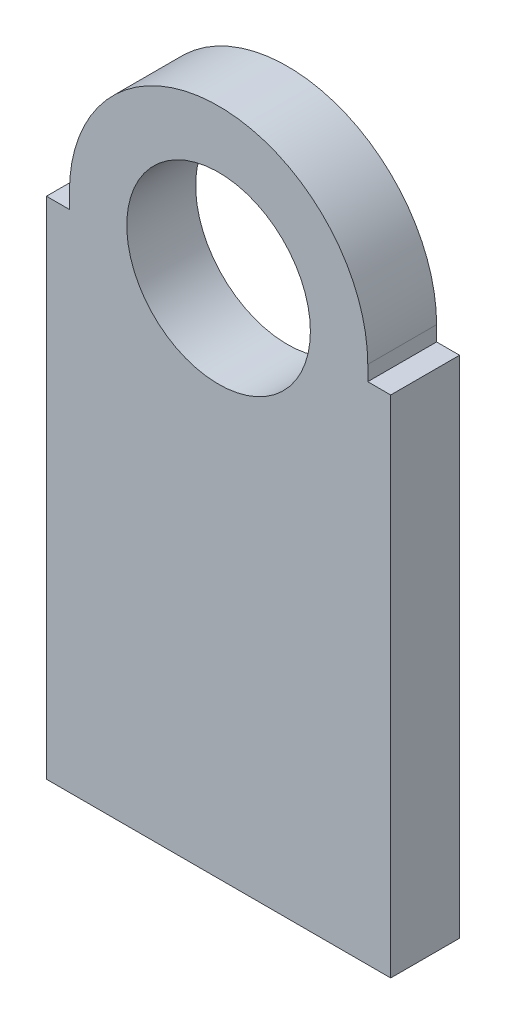
ISO-10303-21;
HEADER;
FILE_DESCRIPTION(('STEP AP214'),'2;1');
FILE_NAME('part.step','',(''),(''),'','','');
FILE_SCHEMA(('AUTOMOTIVE_DESIGN { 1 0 10303 214 1 1 1 1 }'));
ENDSEC;
DATA;
#1=APPLICATION_CONTEXT('core data for automotive mechanical design processes');
#2=APPLICATION_PROTOCOL_DEFINITION('international standard','automotive_design',2000,#1);
#3=PRODUCT_CONTEXT('',#1,'mechanical');
#4=PRODUCT('Part','Part','',(#3));
#5=PRODUCT_RELATED_PRODUCT_CATEGORY('part','',(#4));
#6=PRODUCT_DEFINITION_FORMATION('','',#4);
#7=PRODUCT_DEFINITION_CONTEXT('part definition',#1,'design');
#8=PRODUCT_DEFINITION('design','',#6,#7);
#9=PRODUCT_DEFINITION_SHAPE('','',#8);
#10=(LENGTH_UNIT() NAMED_UNIT(*) SI_UNIT(.MILLI.,.METRE.));
#11=(NAMED_UNIT(*) PLANE_ANGLE_UNIT() SI_UNIT($,.RADIAN.));
#12=(NAMED_UNIT(*) SI_UNIT($,.STERADIAN.) SOLID_ANGLE_UNIT());
#13=UNCERTAINTY_MEASURE_WITH_UNIT(LENGTH_MEASURE(1.E-05),#10,'distance_accuracy_value','');
#14=(GEOMETRIC_REPRESENTATION_CONTEXT(3) GLOBAL_UNCERTAINTY_ASSIGNED_CONTEXT((#13)) GLOBAL_UNIT_ASSIGNED_CONTEXT((#10,
#11,#12)) REPRESENTATION_CONTEXT('',''));
#15=CARTESIAN_POINT('',(0.,0.,0.));
#16=DIRECTION('',(0.,0.,1.));
#17=DIRECTION('',(1.,0.,0.));
#18=AXIS2_PLACEMENT_3D('',#15,#16,#17);
#19=CARTESIAN_POINT('',(3.25,0.,1.5));
#20=DIRECTION('',(1.,0.,0.));
#21=DIRECTION('',(0.,0.,-1.));
#22=AXIS2_PLACEMENT_3D('',#19,#20,#21);
#23=PLANE('',#22);
#24=DIRECTION('',(0.,-1.,0.));
#25=VECTOR('',#24,1.);
#26=CARTESIAN_POINT('',(3.25,0.,0.));
#27=LINE('',#26,#25);
#28=CARTESIAN_POINT('',(3.25,0.,0.));
#29=VERTEX_POINT('',#28);
#30=CARTESIAN_POINT('',(3.25,-0.326709371490288,0.));
#31=VERTEX_POINT('',#30);
#32=EDGE_CURVE('E146',#29,#31,#27,.T.);
#33=ORIENTED_EDGE('',*,*,#32,.F.);
#34=DIRECTION('',(0.,0.,-1.));
#35=VECTOR('',#34,1.);
#36=CARTESIAN_POINT('',(3.25,0.,1.5));
#37=LINE('',#36,#35);
#38=CARTESIAN_POINT('',(3.25,0.,1.5));
#39=VERTEX_POINT('',#38);
#40=EDGE_CURVE('E11',#39,#29,#37,.T.);
#41=ORIENTED_EDGE('',*,*,#40,.F.);
#42=DIRECTION('',(0.,-1.,0.));
#43=VECTOR('',#42,1.);
#44=CARTESIAN_POINT('',(3.25,0.,1.5));
#45=LINE('',#44,#43);
#46=CARTESIAN_POINT('',(3.25,-0.326709371490288,1.5));
#47=VERTEX_POINT('',#46);
#48=EDGE_CURVE('E177',#39,#47,#45,.T.);
#49=ORIENTED_EDGE('',*,*,#48,.T.);
#50=DIRECTION('',(0.,0.,-1.));
#51=VECTOR('',#50,1.);
#52=CARTESIAN_POINT('',(3.25,-0.326709371490288,1.5));
#53=LINE('',#52,#51);
#54=EDGE_CURVE('E93',#47,#31,#53,.T.);
#55=ORIENTED_EDGE('',*,*,#54,.T.);
#56=EDGE_LOOP('',(#33,#41,#49,#55));
#57=FACE_BOUND('',#56,.T.);
#58=ADVANCED_FACE('F42',(#57),#23,.T.);
#59=CARTESIAN_POINT('',(0.,0.,1.5));
#60=DIRECTION('',(0.,0.,-1.));
#61=DIRECTION('',(-1.,0.,0.));
#62=AXIS2_PLACEMENT_3D('',#59,#60,#61);
#63=CYLINDRICAL_SURFACE('',#62,3.25);
#64=CARTESIAN_POINT('',(0.,0.,0.));
#65=DIRECTION('',(0.,0.,1.));
#66=DIRECTION('',(1.,0.,0.));
#67=AXIS2_PLACEMENT_3D('',#64,#65,#66);
#68=CIRCLE('',#67,3.25);
#69=CARTESIAN_POINT('',(-3.25,0.,0.));
#70=VERTEX_POINT('',#69);
#71=EDGE_CURVE('E150',#29,#70,#68,.T.);
#72=ORIENTED_EDGE('',*,*,#71,.T.);
#73=DIRECTION('',(0.,0.,-1.));
#74=VECTOR('',#73,1.);
#75=CARTESIAN_POINT('',(-3.25,0.,1.5));
#76=LINE('',#75,#74);
#77=CARTESIAN_POINT('',(-3.25,0.,1.5));
#78=VERTEX_POINT('',#77);
#79=EDGE_CURVE('E51',#78,#70,#76,.T.);
#80=ORIENTED_EDGE('',*,*,#79,.F.);
#81=CARTESIAN_POINT('',(0.,0.,1.5));
#82=DIRECTION('',(0.,0.,1.));
#83=DIRECTION('',(1.,0.,0.));
#84=AXIS2_PLACEMENT_3D('',#81,#82,#83);
#85=CIRCLE('',#84,3.25);
#86=EDGE_CURVE('E213',#39,#78,#85,.T.);
#87=ORIENTED_EDGE('',*,*,#86,.F.);
#88=ORIENTED_EDGE('',*,*,#40,.T.);
#89=EDGE_LOOP('',(#72,#80,#87,#88));
#90=FACE_BOUND('',#89,.T.);
#91=ADVANCED_FACE('F219',(#90),#63,.T.);
#92=CARTESIAN_POINT('',(-3.25,0.,1.5));
#93=DIRECTION('',(1.,0.,0.));
#94=DIRECTION('',(0.,0.,-1.));
#95=AXIS2_PLACEMENT_3D('',#92,#93,#94);
#96=PLANE('',#95);
#97=DIRECTION('',(0.,-1.,0.));
#98=VECTOR('',#97,1.);
#99=CARTESIAN_POINT('',(-3.25,0.,0.));
#100=LINE('',#99,#98);
#101=CARTESIAN_POINT('',(-3.25,-0.326709371490288,0.));
#102=VERTEX_POINT('',#101);
#103=EDGE_CURVE('E153',#70,#102,#100,.T.);
#104=ORIENTED_EDGE('',*,*,#103,.T.);
#105=DIRECTION('',(0.,0.,-1.));
#106=VECTOR('',#105,1.);
#107=CARTESIAN_POINT('',(-3.25,-0.326709371490288,1.5));
#108=LINE('',#107,#106);
#109=CARTESIAN_POINT('',(-3.25,-0.326709371490288,1.5));
#110=VERTEX_POINT('',#109);
#111=EDGE_CURVE('E187',#110,#102,#108,.T.);
#112=ORIENTED_EDGE('',*,*,#111,.F.);
#113=DIRECTION('',(0.,-1.,0.));
#114=VECTOR('',#113,1.);
#115=CARTESIAN_POINT('',(-3.25,0.,1.5));
#116=LINE('',#115,#114);
#117=EDGE_CURVE('E197',#78,#110,#116,.T.);
#118=ORIENTED_EDGE('',*,*,#117,.F.);
#119=ORIENTED_EDGE('',*,*,#79,.T.);
#120=EDGE_LOOP('',(#104,#112,#118,#119));
#121=FACE_BOUND('',#120,.T.);
#122=ADVANCED_FACE('F195',(#121),#96,.F.);
#123=CARTESIAN_POINT('',(0.,-0.326709371490288,1.5));
#124=DIRECTION('',(0.,1.,0.));
#125=DIRECTION('',(0.,0.,1.));
#126=AXIS2_PLACEMENT_3D('',#123,#124,#125);
#127=PLANE('',#126);
#128=DIRECTION('',(1.,0.,0.));
#129=VECTOR('',#128,1.);
#130=CARTESIAN_POINT('',(0.,-0.326709371490288,0.));
#131=LINE('',#130,#129);
#132=CARTESIAN_POINT('',(-3.75,-0.326709371490288,0.));
#133=VERTEX_POINT('',#132);
#134=EDGE_CURVE('E157',#133,#102,#131,.T.);
#135=ORIENTED_EDGE('',*,*,#134,.F.);
#136=DIRECTION('',(0.,0.,-1.));
#137=VECTOR('',#136,1.);
#138=CARTESIAN_POINT('',(-3.75,-0.326709371490288,1.5));
#139=LINE('',#138,#137);
#140=CARTESIAN_POINT('',(-3.75,-0.326709371490288,1.5));
#141=VERTEX_POINT('',#140);
#142=EDGE_CURVE('E184',#141,#133,#139,.T.);
#143=ORIENTED_EDGE('',*,*,#142,.F.);
#144=DIRECTION('',(1.,0.,0.));
#145=VECTOR('',#144,1.);
#146=CARTESIAN_POINT('',(0.,-0.326709371490288,1.5));
#147=LINE('',#146,#145);
#148=EDGE_CURVE('E208',#141,#110,#147,.T.);
#149=ORIENTED_EDGE('',*,*,#148,.T.);
#150=ORIENTED_EDGE('',*,*,#111,.T.);
#151=EDGE_LOOP('',(#135,#143,#149,#150));
#152=FACE_BOUND('',#151,.T.);
#153=ADVANCED_FACE('F206',(#152),#127,.T.);
#154=CARTESIAN_POINT('',(-3.75,0.,1.5));
#155=DIRECTION('',(1.,0.,0.));
#156=DIRECTION('',(0.,1.,0.));
#157=AXIS2_PLACEMENT_3D('',#154,#155,#156);
#158=PLANE('',#157);
#159=DIRECTION('',(0.,-1.,0.));
#160=VECTOR('',#159,1.);
#161=CARTESIAN_POINT('',(-3.75,0.,0.));
#162=LINE('',#161,#160);
#163=CARTESIAN_POINT('',(-3.75,-11.3267093714903,0.));
#164=VERTEX_POINT('',#163);
#165=EDGE_CURVE('E161',#133,#164,#162,.T.);
#166=ORIENTED_EDGE('',*,*,#165,.T.);
#167=DIRECTION('',(0.,0.,-1.));
#168=VECTOR('',#167,1.);
#169=CARTESIAN_POINT('',(-3.75,-11.3267093714903,1.5));
#170=LINE('',#169,#168);
#171=CARTESIAN_POINT('',(-3.75,-11.3267093714903,1.5));
#172=VERTEX_POINT('',#171);
#173=EDGE_CURVE('E124',#172,#164,#170,.T.);
#174=ORIENTED_EDGE('',*,*,#173,.F.);
#175=DIRECTION('',(0.,-1.,0.));
#176=VECTOR('',#175,1.);
#177=CARTESIAN_POINT('',(-3.75,0.,1.5));
#178=LINE('',#177,#176);
#179=EDGE_CURVE('E131',#141,#172,#178,.T.);
#180=ORIENTED_EDGE('',*,*,#179,.F.);
#181=ORIENTED_EDGE('',*,*,#142,.T.);
#182=EDGE_LOOP('',(#166,#174,#180,#181));
#183=FACE_BOUND('',#182,.T.);
#184=ADVANCED_FACE('F229',(#183),#158,.F.);
#185=CARTESIAN_POINT('',(0.,-11.3267093714903,1.5));
#186=DIRECTION('',(0.,-1.,0.));
#187=DIRECTION('',(0.,0.,-1.));
#188=AXIS2_PLACEMENT_3D('',#185,#186,#187);
#189=PLANE('',#188);
#190=DIRECTION('',(-1.,0.,0.));
#191=VECTOR('',#190,1.);
#192=CARTESIAN_POINT('',(0.,-11.3267093714903,0.));
#193=LINE('',#192,#191);
#194=CARTESIAN_POINT('',(3.75,-11.3267093714903,0.));
#195=VERTEX_POINT('',#194);
#196=EDGE_CURVE('E118',#195,#164,#193,.T.);
#197=ORIENTED_EDGE('',*,*,#196,.F.);
#198=DIRECTION('',(0.,0.,-1.));
#199=VECTOR('',#198,1.);
#200=CARTESIAN_POINT('',(3.75,-11.3267093714903,1.5));
#201=LINE('',#200,#199);
#202=CARTESIAN_POINT('',(3.75,-11.3267093714903,1.5));
#203=VERTEX_POINT('',#202);
#204=EDGE_CURVE('E113',#203,#195,#201,.T.);
#205=ORIENTED_EDGE('',*,*,#204,.F.);
#206=DIRECTION('',(-1.,0.,0.));
#207=VECTOR('',#206,1.);
#208=CARTESIAN_POINT('',(0.,-11.3267093714903,1.5));
#209=LINE('',#208,#207);
#210=EDGE_CURVE('E116',#203,#172,#209,.T.);
#211=ORIENTED_EDGE('',*,*,#210,.T.);
#212=ORIENTED_EDGE('',*,*,#173,.T.);
#213=EDGE_LOOP('',(#197,#205,#211,#212));
#214=FACE_BOUND('',#213,.T.);
#215=ADVANCED_FACE('F115',(#214),#189,.T.);
#216=CARTESIAN_POINT('',(3.75,0.,1.5));
#217=DIRECTION('',(1.,0.,0.));
#218=DIRECTION('',(0.,1.,0.));
#219=AXIS2_PLACEMENT_3D('',#216,#217,#218);
#220=PLANE('',#219);
#221=DIRECTION('',(0.,-1.,0.));
#222=VECTOR('',#221,1.);
#223=CARTESIAN_POINT('',(3.75,0.,0.));
#224=LINE('',#223,#222);
#225=CARTESIAN_POINT('',(3.75,-0.326709371490288,0.));
#226=VERTEX_POINT('',#225);
#227=EDGE_CURVE('E167',#226,#195,#224,.T.);
#228=ORIENTED_EDGE('',*,*,#227,.F.);
#229=DIRECTION('',(0.,0.,-1.));
#230=VECTOR('',#229,1.);
#231=CARTESIAN_POINT('',(3.75,-0.326709371490288,1.5));
#232=LINE('',#231,#230);
#233=CARTESIAN_POINT('',(3.75,-0.326709371490288,1.5));
#234=VERTEX_POINT('',#233);
#235=EDGE_CURVE('E86',#234,#226,#232,.T.);
#236=ORIENTED_EDGE('',*,*,#235,.F.);
#237=DIRECTION('',(0.,-1.,0.));
#238=VECTOR('',#237,1.);
#239=CARTESIAN_POINT('',(3.75,0.,1.5));
#240=LINE('',#239,#238);
#241=EDGE_CURVE('E128',#234,#203,#240,.T.);
#242=ORIENTED_EDGE('',*,*,#241,.T.);
#243=ORIENTED_EDGE('',*,*,#204,.T.);
#244=EDGE_LOOP('',(#228,#236,#242,#243));
#245=FACE_BOUND('',#244,.T.);
#246=ADVANCED_FACE('F135',(#245),#220,.T.);
#247=CARTESIAN_POINT('',(0.,-0.326709371490288,1.5));
#248=DIRECTION('',(0.,-1.,0.));
#249=DIRECTION('',(0.,0.,-1.));
#250=AXIS2_PLACEMENT_3D('',#247,#248,#249);
#251=PLANE('',#250);
#252=DIRECTION('',(-1.,0.,0.));
#253=VECTOR('',#252,1.);
#254=CARTESIAN_POINT('',(0.,-0.326709371490288,0.));
#255=LINE('',#254,#253);
#256=EDGE_CURVE('E170',#226,#31,#255,.T.);
#257=ORIENTED_EDGE('',*,*,#256,.T.);
#258=ORIENTED_EDGE('',*,*,#54,.F.);
#259=DIRECTION('',(-1.,0.,0.));
#260=VECTOR('',#259,1.);
#261=CARTESIAN_POINT('',(0.,-0.326709371490288,1.5));
#262=LINE('',#261,#260);
#263=EDGE_CURVE('E59',#234,#47,#262,.T.);
#264=ORIENTED_EDGE('',*,*,#263,.F.);
#265=ORIENTED_EDGE('',*,*,#235,.T.);
#266=EDGE_LOOP('',(#257,#258,#264,#265));
#267=FACE_BOUND('',#266,.T.);
#268=ADVANCED_FACE('F237',(#267),#251,.F.);
#269=CARTESIAN_POINT('',(0.,0.,1.5));
#270=DIRECTION('',(0.,0.,-1.));
#271=DIRECTION('',(-1.,0.,0.));
#272=AXIS2_PLACEMENT_3D('',#269,#270,#271);
#273=CYLINDRICAL_SURFACE('',#272,2.);
#274=CARTESIAN_POINT('',(0.,0.,1.5));
#275=DIRECTION('',(0.,0.,1.));
#276=DIRECTION('',(1.,0.,0.));
#277=AXIS2_PLACEMENT_3D('',#274,#275,#276);
#278=CIRCLE('',#277,2.);
#279=CARTESIAN_POINT('',(2.,0.,1.5));
#280=VERTEX_POINT('',#279);
#281=EDGE_CURVE('E139',#280,#280,#278,.T.);
#282=ORIENTED_EDGE('',*,*,#281,.T.);
#283=EDGE_LOOP('',(#282));
#284=FACE_BOUND('',#283,.T.);
#285=CARTESIAN_POINT('',(0.,0.,0.));
#286=DIRECTION('',(0.,0.,1.));
#287=DIRECTION('',(1.,0.,0.));
#288=AXIS2_PLACEMENT_3D('',#285,#286,#287);
#289=CIRCLE('',#288,2.);
#290=CARTESIAN_POINT('',(2.,0.,0.));
#291=VERTEX_POINT('',#290);
#292=EDGE_CURVE('E173',#291,#291,#289,.T.);
#293=ORIENTED_EDGE('',*,*,#292,.F.);
#294=EDGE_LOOP('',(#293));
#295=FACE_BOUND('',#294,.T.);
#296=ADVANCED_FACE('F240',(#284,#295),#273,.F.);
#297=CARTESIAN_POINT('',(0.,0.,1.5));
#298=DIRECTION('',(0.,0.,1.));
#299=DIRECTION('',(1.,0.,0.));
#300=AXIS2_PLACEMENT_3D('',#297,#298,#299);
#301=PLANE('',#300);
#302=ORIENTED_EDGE('',*,*,#48,.F.);
#303=ORIENTED_EDGE('',*,*,#86,.T.);
#304=ORIENTED_EDGE('',*,*,#117,.T.);
#305=ORIENTED_EDGE('',*,*,#148,.F.);
#306=ORIENTED_EDGE('',*,*,#179,.T.);
#307=ORIENTED_EDGE('',*,*,#210,.F.);
#308=ORIENTED_EDGE('',*,*,#241,.F.);
#309=ORIENTED_EDGE('',*,*,#263,.T.);
#310=EDGE_LOOP('',(#302,#303,#304,#305,#306,#307,#308,#309));
#311=FACE_BOUND('',#310,.T.);
#312=ORIENTED_EDGE('',*,*,#281,.F.);
#313=EDGE_LOOP('',(#312));
#314=FACE_BOUND('',#313,.T.);
#315=ADVANCED_FACE('F126',(#311,#314),#301,.T.);
#316=CARTESIAN_POINT('',(0.,0.,0.));
#317=DIRECTION('',(0.,0.,1.));
#318=DIRECTION('',(1.,0.,0.));
#319=AXIS2_PLACEMENT_3D('',#316,#317,#318);
#320=PLANE('',#319);
#321=ORIENTED_EDGE('',*,*,#32,.T.);
#322=ORIENTED_EDGE('',*,*,#256,.F.);
#323=ORIENTED_EDGE('',*,*,#227,.T.);
#324=ORIENTED_EDGE('',*,*,#196,.T.);
#325=ORIENTED_EDGE('',*,*,#165,.F.);
#326=ORIENTED_EDGE('',*,*,#134,.T.);
#327=ORIENTED_EDGE('',*,*,#103,.F.);
#328=ORIENTED_EDGE('',*,*,#71,.F.);
#329=EDGE_LOOP('',(#321,#322,#323,#324,#325,#326,#327,#328));
#330=FACE_BOUND('',#329,.T.);
#331=ORIENTED_EDGE('',*,*,#292,.T.);
#332=EDGE_LOOP('',(#331));
#333=FACE_BOUND('',#332,.T.);
#334=ADVANCED_FACE('F201',(#330,#333),#320,.F.);
#335=CLOSED_SHELL('',(#58,#91,#122,#153,#184,#215,#246,#268,#296,#315,#334));
#336=MANIFOLD_SOLID_BREP('B2',#335);
#337=ADVANCED_BREP_SHAPE_REPRESENTATION('',(#18,#336),#14);
#338=SHAPE_DEFINITION_REPRESENTATION(#9,#337);
ENDSEC;
END-ISO-10303-21;
